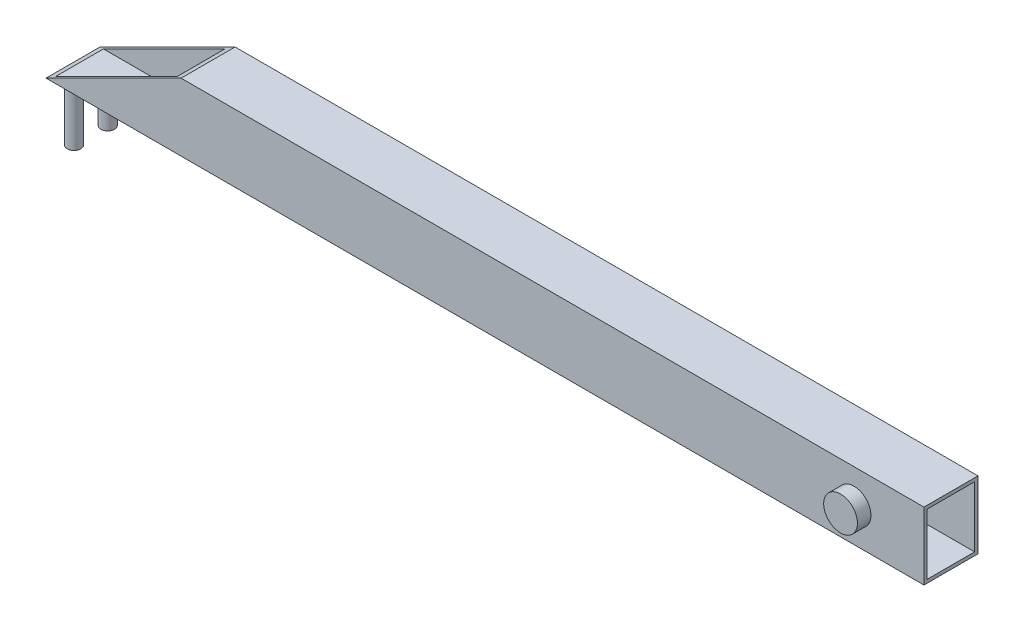
ISO-10303-21;
HEADER;
FILE_DESCRIPTION(('STEP AP214'),'2;1');
FILE_NAME('part.step','',(''),(''),'','','');
FILE_SCHEMA(('AUTOMOTIVE_DESIGN { 1 0 10303 214 1 1 1 1 }'));
ENDSEC;
DATA;
#1=APPLICATION_CONTEXT('core data for automotive mechanical design processes');
#2=APPLICATION_PROTOCOL_DEFINITION('international standard','automotive_design',2000,#1);
#3=PRODUCT_CONTEXT('',#1,'mechanical');
#4=PRODUCT('Part','Part','',(#3));
#5=PRODUCT_RELATED_PRODUCT_CATEGORY('part','',(#4));
#6=PRODUCT_DEFINITION_FORMATION('','',#4);
#7=PRODUCT_DEFINITION_CONTEXT('part definition',#1,'design');
#8=PRODUCT_DEFINITION('design','',#6,#7);
#9=PRODUCT_DEFINITION_SHAPE('','',#8);
#10=(LENGTH_UNIT() NAMED_UNIT(*) SI_UNIT(.MILLI.,.METRE.));
#11=(NAMED_UNIT(*) PLANE_ANGLE_UNIT() SI_UNIT($,.RADIAN.));
#12=(NAMED_UNIT(*) SI_UNIT($,.STERADIAN.) SOLID_ANGLE_UNIT());
#13=UNCERTAINTY_MEASURE_WITH_UNIT(LENGTH_MEASURE(1.E-05),#10,'distance_accuracy_value','');
#14=(GEOMETRIC_REPRESENTATION_CONTEXT(3) GLOBAL_UNCERTAINTY_ASSIGNED_CONTEXT((#13)) GLOBAL_UNIT_ASSIGNED_CONTEXT((#10,
#11,#12)) REPRESENTATION_CONTEXT('',''));
#15=CARTESIAN_POINT('',(0.,0.,0.));
#16=DIRECTION('',(0.,0.,1.));
#17=DIRECTION('',(1.,0.,0.));
#18=AXIS2_PLACEMENT_3D('',#15,#16,#17);
#19=CARTESIAN_POINT('',(0.,0.,10.));
#20=DIRECTION('',(0.,0.,-1.));
#21=DIRECTION('',(-1.,0.,0.));
#22=AXIS2_PLACEMENT_3D('',#19,#20,#21);
#23=CYLINDRICAL_SURFACE('',#22,2.5);
#24=CARTESIAN_POINT('',(0.,0.,10.));
#25=DIRECTION('',(0.,0.,1.));
#26=DIRECTION('',(1.,0.,0.));
#27=AXIS2_PLACEMENT_3D('',#24,#25,#26);
#28=CIRCLE('',#27,2.5);
#29=CARTESIAN_POINT('',(2.5,0.,10.));
#30=VERTEX_POINT('',#29);
#31=EDGE_CURVE('E11',#30,#30,#28,.T.);
#32=ORIENTED_EDGE('',*,*,#31,.F.);
#33=EDGE_LOOP('',(#32));
#34=FACE_BOUND('',#33,.T.);
#35=CARTESIAN_POINT('',(0.,0.,8.));
#36=DIRECTION('',(0.,0.,1.));
#37=DIRECTION('',(1.,0.,0.));
#38=AXIS2_PLACEMENT_3D('',#35,#36,#37);
#39=CIRCLE('',#38,2.5);
#40=CARTESIAN_POINT('',(2.5,0.,8.));
#41=VERTEX_POINT('',#40);
#42=EDGE_CURVE('E44',#41,#41,#39,.T.);
#43=ORIENTED_EDGE('',*,*,#42,.T.);
#44=EDGE_LOOP('',(#43));
#45=FACE_BOUND('',#44,.T.);
#46=ADVANCED_FACE('F41',(#34,#45),#23,.T.);
#47=CARTESIAN_POINT('',(0.,0.,10.));
#48=DIRECTION('',(0.,0.,1.));
#49=DIRECTION('',(1.,0.,0.));
#50=AXIS2_PLACEMENT_3D('',#47,#48,#49);
#51=PLANE('',#50);
#52=ORIENTED_EDGE('',*,*,#31,.T.);
#53=EDGE_LOOP('',(#52));
#54=FACE_BOUND('',#53,.T.);
#55=ADVANCED_FACE('F56',(#54),#51,.T.);
#56=CARTESIAN_POINT('',(0.,0.,8.));
#57=DIRECTION('',(0.,0.,1.));
#58=DIRECTION('',(1.,0.,0.));
#59=AXIS2_PLACEMENT_3D('',#56,#57,#58);
#60=PLANE('',#59);
#61=ORIENTED_EDGE('',*,*,#42,.F.);
#62=EDGE_LOOP('',(#61));
#63=FACE_BOUND('',#62,.T.);
#64=ADVANCED_FACE('F54',(#63),#60,.F.);
#65=CLOSED_SHELL('',(#46,#55,#64));
#66=MANIFOLD_SOLID_BREP('B2',#65);
#67=CARTESIAN_POINT('',(0.,0.,8.));
#68=DIRECTION('',(0.,0.,-1.));
#69=DIRECTION('',(-1.,0.,0.));
#70=AXIS2_PLACEMENT_3D('',#67,#68,#69);
#71=CYLINDRICAL_SURFACE('',#70,2.5);
#72=CARTESIAN_POINT('',(0.,0.,0.5));
#73=DIRECTION('',(0.,0.,-1.));
#74=DIRECTION('',(0.,1.,0.));
#75=AXIS2_PLACEMENT_3D('',#72,#73,#74);
#76=CIRCLE('',#75,2.5);
#77=CARTESIAN_POINT('',(0.,2.5,0.5));
#78=VERTEX_POINT('',#77);
#79=EDGE_CURVE('E177',#78,#78,#76,.T.);
#80=ORIENTED_EDGE('',*,*,#79,.F.);
#81=EDGE_LOOP('',(#80));
#82=FACE_BOUND('',#81,.T.);
#83=CARTESIAN_POINT('',(0.,0.,0.));
#84=DIRECTION('',(0.,0.,1.));
#85=DIRECTION('',(1.,0.,0.));
#86=AXIS2_PLACEMENT_3D('',#83,#84,#85);
#87=CIRCLE('',#86,2.5);
#88=CARTESIAN_POINT('',(2.5,0.,0.));
#89=VERTEX_POINT('',#88);
#90=EDGE_CURVE('E181',#89,#89,#87,.T.);
#91=ORIENTED_EDGE('',*,*,#90,.F.);
#92=EDGE_LOOP('',(#91));
#93=FACE_BOUND('',#92,.T.);
#94=ADVANCED_FACE('F82',(#82,#93),#71,.F.);
#95=CARTESIAN_POINT('',(0.,0.,8.));
#96=DIRECTION('',(0.,0.,-1.));
#97=DIRECTION('',(-1.,0.,0.));
#98=AXIS2_PLACEMENT_3D('',#95,#96,#97);
#99=PLANE('',#98);
#100=DIRECTION('',(0.,1.,0.));
#101=VECTOR('',#100,1.);
#102=CARTESIAN_POINT('',(10.3505791748001,0.,8.));
#103=LINE('',#102,#101);
#104=CARTESIAN_POINT('',(10.3505791748001,-5.,8.));
#105=VERTEX_POINT('',#104);
#106=CARTESIAN_POINT('',(10.3505791748001,5.,8.));
#107=VERTEX_POINT('',#106);
#108=EDGE_CURVE('E188',#105,#107,#103,.T.);
#109=ORIENTED_EDGE('',*,*,#108,.T.);
#110=DIRECTION('',(-1.,0.,0.));
#111=VECTOR('',#110,1.);
#112=CARTESIAN_POINT('',(10.3505791748001,5.,8.));
#113=LINE('',#112,#111);
#114=CARTESIAN_POINT('',(-99.6494208251999,4.99999999999999,8.));
#115=VERTEX_POINT('',#114);
#116=EDGE_CURVE('E190',#107,#115,#113,.T.);
#117=ORIENTED_EDGE('',*,*,#116,.T.);
#118=DIRECTION('',(-0.894427190999916,-0.447213595499958,0.));
#119=VECTOR('',#118,1.);
#120=CARTESIAN_POINT('',(-99.6494208251999,4.99999999999999,8.));
#121=LINE('',#120,#119);
#122=CARTESIAN_POINT('',(-119.6494208252,-5.00000000000002,8.));
#123=VERTEX_POINT('',#122);
#124=EDGE_CURVE('E193',#115,#123,#121,.T.);
#125=ORIENTED_EDGE('',*,*,#124,.T.);
#126=DIRECTION('',(1.,0.,0.));
#127=VECTOR('',#126,1.);
#128=CARTESIAN_POINT('',(10.3505791748001,-5.,8.));
#129=LINE('',#128,#127);
#130=EDGE_CURVE('E195',#123,#105,#129,.T.);
#131=ORIENTED_EDGE('',*,*,#130,.T.);
#132=EDGE_LOOP('',(#109,#117,#125,#131));
#133=FACE_BOUND('',#132,.T.);
#134=CARTESIAN_POINT('',(0.,0.,8.));
#135=DIRECTION('',(0.,0.,1.));
#136=DIRECTION('',(1.,0.,0.));
#137=AXIS2_PLACEMENT_3D('',#134,#135,#136);
#138=CIRCLE('',#137,2.5);
#139=CARTESIAN_POINT('',(2.5,0.,8.));
#140=VERTEX_POINT('',#139);
#141=EDGE_CURVE('E182',#140,#140,#138,.T.);
#142=ORIENTED_EDGE('',*,*,#141,.F.);
#143=EDGE_LOOP('',(#142));
#144=FACE_BOUND('',#143,.T.);
#145=ADVANCED_FACE('F245',(#133,#144),#99,.F.);
#146=CARTESIAN_POINT('',(0.,0.,0.));
#147=DIRECTION('',(0.,0.,-1.));
#148=DIRECTION('',(-1.,0.,0.));
#149=AXIS2_PLACEMENT_3D('',#146,#147,#148);
#150=PLANE('',#149);
#151=DIRECTION('',(0.,1.,0.));
#152=VECTOR('',#151,1.);
#153=CARTESIAN_POINT('',(10.3505791748001,0.,0.));
#154=LINE('',#153,#152);
#155=CARTESIAN_POINT('',(10.3505791748001,-5.,0.));
#156=VERTEX_POINT('',#155);
#157=CARTESIAN_POINT('',(10.3505791748001,5.,0.));
#158=VERTEX_POINT('',#157);
#159=EDGE_CURVE('E185',#156,#158,#154,.T.);
#160=ORIENTED_EDGE('',*,*,#159,.F.);
#161=DIRECTION('',(1.,0.,0.));
#162=VECTOR('',#161,1.);
#163=CARTESIAN_POINT('',(10.3505791748001,-5.,0.));
#164=LINE('',#163,#162);
#165=CARTESIAN_POINT('',(-119.6494208252,-5.00000000000002,0.));
#166=VERTEX_POINT('',#165);
#167=EDGE_CURVE('E191',#166,#156,#164,.T.);
#168=ORIENTED_EDGE('',*,*,#167,.F.);
#169=DIRECTION('',(-0.894427190999916,-0.447213595499958,0.));
#170=VECTOR('',#169,1.);
#171=CARTESIAN_POINT('',(-99.6494208251999,4.99999999999999,0.));
#172=LINE('',#171,#170);
#173=CARTESIAN_POINT('',(-99.6494208251999,4.99999999999999,0.));
#174=VERTEX_POINT('',#173);
#175=EDGE_CURVE('E201',#174,#166,#172,.T.);
#176=ORIENTED_EDGE('',*,*,#175,.F.);
#177=DIRECTION('',(-1.,0.,0.));
#178=VECTOR('',#177,1.);
#179=CARTESIAN_POINT('',(10.3505791748001,5.,0.));
#180=LINE('',#179,#178);
#181=EDGE_CURVE('E199',#158,#174,#180,.T.);
#182=ORIENTED_EDGE('',*,*,#181,.F.);
#183=EDGE_LOOP('',(#160,#168,#176,#182));
#184=FACE_BOUND('',#183,.T.);
#185=ORIENTED_EDGE('',*,*,#90,.T.);
#186=EDGE_LOOP('',(#185));
#187=FACE_BOUND('',#186,.T.);
#188=ADVANCED_FACE('F251',(#184,#187),#150,.T.);
#189=CARTESIAN_POINT('',(10.3505791748001,0.,8.));
#190=DIRECTION('',(-1.,0.,0.));
#191=DIRECTION('',(0.,0.,1.));
#192=AXIS2_PLACEMENT_3D('',#189,#190,#191);
#193=PLANE('',#192);
#194=DIRECTION('',(0.,-1.,0.));
#195=VECTOR('',#194,1.);
#196=CARTESIAN_POINT('',(10.3505791748001,4.5,7.58773796870221));
#197=LINE('',#196,#195);
#198=CARTESIAN_POINT('',(10.3505791748001,4.5,7.58773796870221));
#199=VERTEX_POINT('',#198);
#200=CARTESIAN_POINT('',(10.3505791748001,-4.5,7.58773796870221));
#201=VERTEX_POINT('',#200);
#202=EDGE_CURVE('E159',#199,#201,#197,.T.);
#203=ORIENTED_EDGE('',*,*,#202,.F.);
#204=DIRECTION('',(0.,0.,1.));
#205=VECTOR('',#204,1.);
#206=CARTESIAN_POINT('',(10.3505791748001,4.5,7.58773796870221));
#207=LINE('',#206,#205);
#208=CARTESIAN_POINT('',(10.3505791748001,4.5,0.5));
#209=VERTEX_POINT('',#208);
#210=EDGE_CURVE('E97',#209,#199,#207,.T.);
#211=ORIENTED_EDGE('',*,*,#210,.F.);
#212=DIRECTION('',(0.,1.,0.));
#213=VECTOR('',#212,1.);
#214=CARTESIAN_POINT('',(10.3505791748001,4.5,0.5));
#215=LINE('',#214,#213);
#216=CARTESIAN_POINT('',(10.3505791748001,-4.5,0.499999999999999));
#217=VERTEX_POINT('',#216);
#218=EDGE_CURVE('E165',#217,#209,#215,.T.);
#219=ORIENTED_EDGE('',*,*,#218,.F.);
#220=DIRECTION('',(0.,0.,-1.));
#221=VECTOR('',#220,1.);
#222=CARTESIAN_POINT('',(10.3505791748001,-4.5,0.499999999999999));
#223=LINE('',#222,#221);
#224=EDGE_CURVE('E150',#201,#217,#223,.T.);
#225=ORIENTED_EDGE('',*,*,#224,.F.);
#226=EDGE_LOOP('',(#203,#211,#219,#225));
#227=FACE_BOUND('',#226,.T.);
#228=ORIENTED_EDGE('',*,*,#159,.T.);
#229=DIRECTION('',(0.,0.,-1.));
#230=VECTOR('',#229,1.);
#231=CARTESIAN_POINT('',(10.3505791748001,5.,8.));
#232=LINE('',#231,#230);
#233=EDGE_CURVE('E213',#107,#158,#232,.T.);
#234=ORIENTED_EDGE('',*,*,#233,.F.);
#235=ORIENTED_EDGE('',*,*,#108,.F.);
#236=DIRECTION('',(0.,0.,-1.));
#237=VECTOR('',#236,1.);
#238=CARTESIAN_POINT('',(10.3505791748001,-5.,8.));
#239=LINE('',#238,#237);
#240=EDGE_CURVE('E197',#105,#156,#239,.T.);
#241=ORIENTED_EDGE('',*,*,#240,.T.);
#242=EDGE_LOOP('',(#228,#234,#235,#241));
#243=FACE_BOUND('',#242,.T.);
#244=ADVANCED_FACE('F84',(#227,#243),#193,.F.);
#245=CARTESIAN_POINT('',(10.3505791748001,5.,8.));
#246=DIRECTION('',(0.,-1.,0.));
#247=DIRECTION('',(1.,0.,0.));
#248=AXIS2_PLACEMENT_3D('',#245,#246,#247);
#249=PLANE('',#248);
#250=ORIENTED_EDGE('',*,*,#181,.T.);
#251=DIRECTION('',(0.,0.,-1.));
#252=VECTOR('',#251,1.);
#253=CARTESIAN_POINT('',(-99.6494208251999,4.99999999999999,8.));
#254=LINE('',#253,#252);
#255=EDGE_CURVE('E210',#115,#174,#254,.T.);
#256=ORIENTED_EDGE('',*,*,#255,.F.);
#257=ORIENTED_EDGE('',*,*,#116,.F.);
#258=ORIENTED_EDGE('',*,*,#233,.T.);
#259=EDGE_LOOP('',(#250,#256,#257,#258));
#260=FACE_BOUND('',#259,.T.);
#261=ADVANCED_FACE('F254',(#260),#249,.F.);
#262=CARTESIAN_POINT('',(-99.6494208251999,4.99999999999999,8.));
#263=DIRECTION('',(0.447213595499958,-0.894427190999916,0.));
#264=DIRECTION('',(0.894427190999916,0.447213595499958,0.));
#265=AXIS2_PLACEMENT_3D('',#262,#263,#264);
#266=PLANE('',#265);
#267=DIRECTION('',(0.894427190999916,0.447213595499958,0.));
#268=VECTOR('',#267,1.);
#269=CARTESIAN_POINT('',(-99.6494208251999,4.99999999999999,0.5));
#270=LINE('',#269,#268);
#271=CARTESIAN_POINT('',(-118.6494208252,-4.5,0.499999999999999));
#272=VERTEX_POINT('',#271);
#273=CARTESIAN_POINT('',(-100.6494208252,4.50000000000001,0.5));
#274=VERTEX_POINT('',#273);
#275=EDGE_CURVE('E178',#272,#274,#270,.T.);
#276=ORIENTED_EDGE('',*,*,#275,.T.);
#277=DIRECTION('',(0.,0.,1.));
#278=VECTOR('',#277,1.);
#279=CARTESIAN_POINT('',(-100.6494208252,4.5,8.));
#280=LINE('',#279,#278);
#281=CARTESIAN_POINT('',(-100.6494208252,4.50000000000001,7.58773796870221));
#282=VERTEX_POINT('',#281);
#283=EDGE_CURVE('E221',#274,#282,#280,.T.);
#284=ORIENTED_EDGE('',*,*,#283,.T.);
#285=DIRECTION('',(-0.894427190999916,-0.447213595499958,0.));
#286=VECTOR('',#285,1.);
#287=CARTESIAN_POINT('',(-99.6494208251999,4.99999999999999,7.58773796870221));
#288=LINE('',#287,#286);
#289=CARTESIAN_POINT('',(-118.6494208252,-4.5,7.58773796870221));
#290=VERTEX_POINT('',#289);
#291=EDGE_CURVE('E175',#282,#290,#288,.T.);
#292=ORIENTED_EDGE('',*,*,#291,.T.);
#293=DIRECTION('',(0.,0.,-1.));
#294=VECTOR('',#293,1.);
#295=CARTESIAN_POINT('',(-118.6494208252,-4.5,7.99999999999999));
#296=LINE('',#295,#294);
#297=EDGE_CURVE('E153',#290,#272,#296,.T.);
#298=ORIENTED_EDGE('',*,*,#297,.T.);
#299=EDGE_LOOP('',(#276,#284,#292,#298));
#300=FACE_BOUND('',#299,.T.);
#301=ORIENTED_EDGE('',*,*,#175,.T.);
#302=DIRECTION('',(0.,0.,-1.));
#303=VECTOR('',#302,1.);
#304=CARTESIAN_POINT('',(-119.6494208252,-5.00000000000002,8.));
#305=LINE('',#304,#303);
#306=EDGE_CURVE('E207',#123,#166,#305,.T.);
#307=ORIENTED_EDGE('',*,*,#306,.F.);
#308=ORIENTED_EDGE('',*,*,#124,.F.);
#309=ORIENTED_EDGE('',*,*,#255,.T.);
#310=EDGE_LOOP('',(#301,#307,#308,#309));
#311=FACE_BOUND('',#310,.T.);
#312=ADVANCED_FACE('F232',(#300,#311),#266,.F.);
#313=CARTESIAN_POINT('',(10.3505791748001,-5.,8.));
#314=DIRECTION('',(0.,1.,0.));
#315=DIRECTION('',(-1.,0.,0.));
#316=AXIS2_PLACEMENT_3D('',#313,#314,#315);
#317=PLANE('',#316);
#318=CARTESIAN_POINT('',(-117.0076260807,-5.00000000000002,1.5));
#319=DIRECTION('',(0.,1.,0.));
#320=DIRECTION('',(-1.,0.,0.));
#321=AXIS2_PLACEMENT_3D('',#318,#319,#320);
#322=CIRCLE('',#321,0.999999999999998);
#323=CARTESIAN_POINT('',(-118.0076260807,-5.00000000000002,1.5));
#324=VERTEX_POINT('',#323);
#325=EDGE_CURVE('E39',#324,#324,#322,.F.);
#326=ORIENTED_EDGE('',*,*,#325,.F.);
#327=EDGE_LOOP('',(#326));
#328=FACE_BOUND('',#327,.T.);
#329=CARTESIAN_POINT('',(-117.0076260807,-5.00000000000002,6.5));
#330=DIRECTION('',(0.,1.,0.));
#331=DIRECTION('',(-1.,0.,0.));
#332=AXIS2_PLACEMENT_3D('',#329,#330,#331);
#333=CIRCLE('',#332,0.999999999999998);
#334=CARTESIAN_POINT('',(-118.0076260807,-5.00000000000002,6.5));
#335=VERTEX_POINT('',#334);
#336=EDGE_CURVE('E90',#335,#335,#333,.F.);
#337=ORIENTED_EDGE('',*,*,#336,.F.);
#338=EDGE_LOOP('',(#337));
#339=FACE_BOUND('',#338,.T.);
#340=ORIENTED_EDGE('',*,*,#167,.T.);
#341=ORIENTED_EDGE('',*,*,#240,.F.);
#342=ORIENTED_EDGE('',*,*,#130,.F.);
#343=ORIENTED_EDGE('',*,*,#306,.T.);
#344=EDGE_LOOP('',(#340,#341,#342,#343));
#345=FACE_BOUND('',#344,.T.);
#346=ADVANCED_FACE('F228',(#328,#339,#345),#317,.F.);
#347=CARTESIAN_POINT('',(0.,0.,7.58773796870221));
#348=DIRECTION('',(0.,0.,1.));
#349=DIRECTION('',(0.,-1.,0.));
#350=AXIS2_PLACEMENT_3D('',#347,#348,#349);
#351=CIRCLE('',#350,2.5);
#352=CARTESIAN_POINT('',(0.,-2.5,7.58773796870221));
#353=VERTEX_POINT('',#352);
#354=EDGE_CURVE('E172',#353,#353,#351,.T.);
#355=ORIENTED_EDGE('',*,*,#354,.F.);
#356=EDGE_LOOP('',(#355));
#357=FACE_BOUND('',#356,.T.);
#358=ORIENTED_EDGE('',*,*,#141,.T.);
#359=EDGE_LOOP('',(#358));
#360=FACE_BOUND('',#359,.T.);
#361=ADVANCED_FACE('F231',(#357,#360),#71,.F.);
#362=CARTESIAN_POINT('',(-589.6494208252,4.5,7.58773796870221));
#363=DIRECTION('',(0.,1.,0.));
#364=DIRECTION('',(0.,0.,1.));
#365=AXIS2_PLACEMENT_3D('',#362,#363,#364);
#366=PLANE('',#365);
#367=DIRECTION('',(1.,0.,0.));
#368=VECTOR('',#367,1.);
#369=CARTESIAN_POINT('',(-589.6494208252,4.5,0.5));
#370=LINE('',#369,#368);
#371=EDGE_CURVE('E170',#274,#209,#370,.T.);
#372=ORIENTED_EDGE('',*,*,#371,.T.);
#373=ORIENTED_EDGE('',*,*,#210,.T.);
#374=DIRECTION('',(1.,0.,0.));
#375=VECTOR('',#374,1.);
#376=CARTESIAN_POINT('',(-589.6494208252,4.5,7.58773796870221));
#377=LINE('',#376,#375);
#378=EDGE_CURVE('E156',#282,#199,#377,.T.);
#379=ORIENTED_EDGE('',*,*,#378,.F.);
#380=ORIENTED_EDGE('',*,*,#283,.F.);
#381=EDGE_LOOP('',(#372,#373,#379,#380));
#382=FACE_BOUND('',#381,.T.);
#383=ADVANCED_FACE('F273',(#382),#366,.F.);
#384=CARTESIAN_POINT('',(-589.6494208252,-4.5,0.499999999999999));
#385=DIRECTION('',(0.,-1.,0.));
#386=DIRECTION('',(0.,0.,-1.));
#387=AXIS2_PLACEMENT_3D('',#384,#385,#386);
#388=PLANE('',#387);
#389=DIRECTION('',(1.,0.,0.));
#390=VECTOR('',#389,1.);
#391=CARTESIAN_POINT('',(-589.6494208252,-4.5,7.58773796870221));
#392=LINE('',#391,#390);
#393=EDGE_CURVE('E105',#290,#201,#392,.T.);
#394=ORIENTED_EDGE('',*,*,#393,.T.);
#395=ORIENTED_EDGE('',*,*,#224,.T.);
#396=DIRECTION('',(1.,0.,0.));
#397=VECTOR('',#396,1.);
#398=CARTESIAN_POINT('',(-589.6494208252,-4.5,0.499999999999999));
#399=LINE('',#398,#397);
#400=EDGE_CURVE('E155',#272,#217,#399,.T.);
#401=ORIENTED_EDGE('',*,*,#400,.F.);
#402=ORIENTED_EDGE('',*,*,#297,.F.);
#403=EDGE_LOOP('',(#394,#395,#401,#402));
#404=FACE_BOUND('',#403,.T.);
#405=ADVANCED_FACE('F147',(#404),#388,.F.);
#406=CARTESIAN_POINT('',(-589.6494208252,4.5,0.5));
#407=DIRECTION('',(0.,0.,-1.));
#408=DIRECTION('',(0.,1.,0.));
#409=AXIS2_PLACEMENT_3D('',#406,#407,#408);
#410=PLANE('',#409);
#411=ORIENTED_EDGE('',*,*,#79,.T.);
#412=EDGE_LOOP('',(#411));
#413=FACE_BOUND('',#412,.T.);
#414=ORIENTED_EDGE('',*,*,#400,.T.);
#415=ORIENTED_EDGE('',*,*,#218,.T.);
#416=ORIENTED_EDGE('',*,*,#371,.F.);
#417=ORIENTED_EDGE('',*,*,#275,.F.);
#418=EDGE_LOOP('',(#414,#415,#416,#417));
#419=FACE_BOUND('',#418,.T.);
#420=ADVANCED_FACE('F283',(#413,#419),#410,.F.);
#421=CARTESIAN_POINT('',(-589.6494208252,4.5,7.58773796870221));
#422=DIRECTION('',(0.,0.,1.));
#423=DIRECTION('',(0.,-1.,0.));
#424=AXIS2_PLACEMENT_3D('',#421,#422,#423);
#425=PLANE('',#424);
#426=ORIENTED_EDGE('',*,*,#354,.T.);
#427=EDGE_LOOP('',(#426));
#428=FACE_BOUND('',#427,.T.);
#429=ORIENTED_EDGE('',*,*,#378,.T.);
#430=ORIENTED_EDGE('',*,*,#202,.T.);
#431=ORIENTED_EDGE('',*,*,#393,.F.);
#432=ORIENTED_EDGE('',*,*,#291,.F.);
#433=EDGE_LOOP('',(#429,#430,#431,#432));
#434=FACE_BOUND('',#433,.T.);
#435=ADVANCED_FACE('F160',(#428,#434),#425,.F.);
#436=CARTESIAN_POINT('',(-117.0076260807,-13.,6.5));
#437=DIRECTION('',(0.,1.,0.));
#438=DIRECTION('',(-1.,0.,0.));
#439=AXIS2_PLACEMENT_3D('',#436,#437,#438);
#440=CYLINDRICAL_SURFACE('',#439,0.999999999999998);
#441=CARTESIAN_POINT('',(-117.0076260807,-13.,6.5));
#442=DIRECTION('',(0.,-1.,0.));
#443=DIRECTION('',(1.,0.,0.));
#444=AXIS2_PLACEMENT_3D('',#441,#442,#443);
#445=CIRCLE('',#444,0.999999999999998);
#446=CARTESIAN_POINT('',(-116.0076260807,-13.,6.5));
#447=VERTEX_POINT('',#446);
#448=EDGE_CURVE('E312',#447,#447,#445,.T.);
#449=ORIENTED_EDGE('',*,*,#448,.F.);
#450=EDGE_LOOP('',(#449));
#451=FACE_BOUND('',#450,.T.);
#452=ORIENTED_EDGE('',*,*,#336,.T.);
#453=EDGE_LOOP('',(#452));
#454=FACE_BOUND('',#453,.T.);
#455=ADVANCED_FACE('F226',(#451,#454),#440,.T.);
#456=CARTESIAN_POINT('',(-117.0076260807,-13.,6.5));
#457=DIRECTION('',(0.,-1.,0.));
#458=DIRECTION('',(1.,0.,0.));
#459=AXIS2_PLACEMENT_3D('',#456,#457,#458);
#460=PLANE('',#459);
#461=ORIENTED_EDGE('',*,*,#448,.T.);
#462=EDGE_LOOP('',(#461));
#463=FACE_BOUND('',#462,.T.);
#464=ADVANCED_FACE('F289',(#463),#460,.T.);
#465=CARTESIAN_POINT('',(-117.0076260807,-13.,1.5));
#466=DIRECTION('',(0.,1.,0.));
#467=DIRECTION('',(-1.,0.,0.));
#468=AXIS2_PLACEMENT_3D('',#465,#466,#467);
#469=CYLINDRICAL_SURFACE('',#468,0.999999999999998);
#470=CARTESIAN_POINT('',(-117.0076260807,-13.,1.5));
#471=DIRECTION('',(0.,-1.,0.));
#472=DIRECTION('',(1.,0.,0.));
#473=AXIS2_PLACEMENT_3D('',#470,#471,#472);
#474=CIRCLE('',#473,0.999999999999998);
#475=CARTESIAN_POINT('',(-116.0076260807,-13.,1.5));
#476=VERTEX_POINT('',#475);
#477=EDGE_CURVE('E311',#476,#476,#474,.T.);
#478=ORIENTED_EDGE('',*,*,#477,.F.);
#479=EDGE_LOOP('',(#478));
#480=FACE_BOUND('',#479,.T.);
#481=ORIENTED_EDGE('',*,*,#325,.T.);
#482=EDGE_LOOP('',(#481));
#483=FACE_BOUND('',#482,.T.);
#484=ADVANCED_FACE('F299',(#480,#483),#469,.T.);
#485=CARTESIAN_POINT('',(-117.0076260807,-13.,1.5));
#486=DIRECTION('',(0.,-1.,0.));
#487=DIRECTION('',(1.,0.,0.));
#488=AXIS2_PLACEMENT_3D('',#485,#486,#487);
#489=PLANE('',#488);
#490=ORIENTED_EDGE('',*,*,#477,.T.);
#491=EDGE_LOOP('',(#490));
#492=FACE_BOUND('',#491,.T.);
#493=ADVANCED_FACE('F303',(#492),#489,.T.);
#494=CLOSED_SHELL('',(#94,#145,#188,#244,#261,#312,#346,#361,#383,#405,#420,#435,#455,#464,#484,#493));
#495=MANIFOLD_SOLID_BREP('B6',#494);
#496=ADVANCED_BREP_SHAPE_REPRESENTATION('',(#18,#66,#495),#14);
#497=SHAPE_DEFINITION_REPRESENTATION(#9,#496);
ENDSEC;
END-ISO-10303-21;
